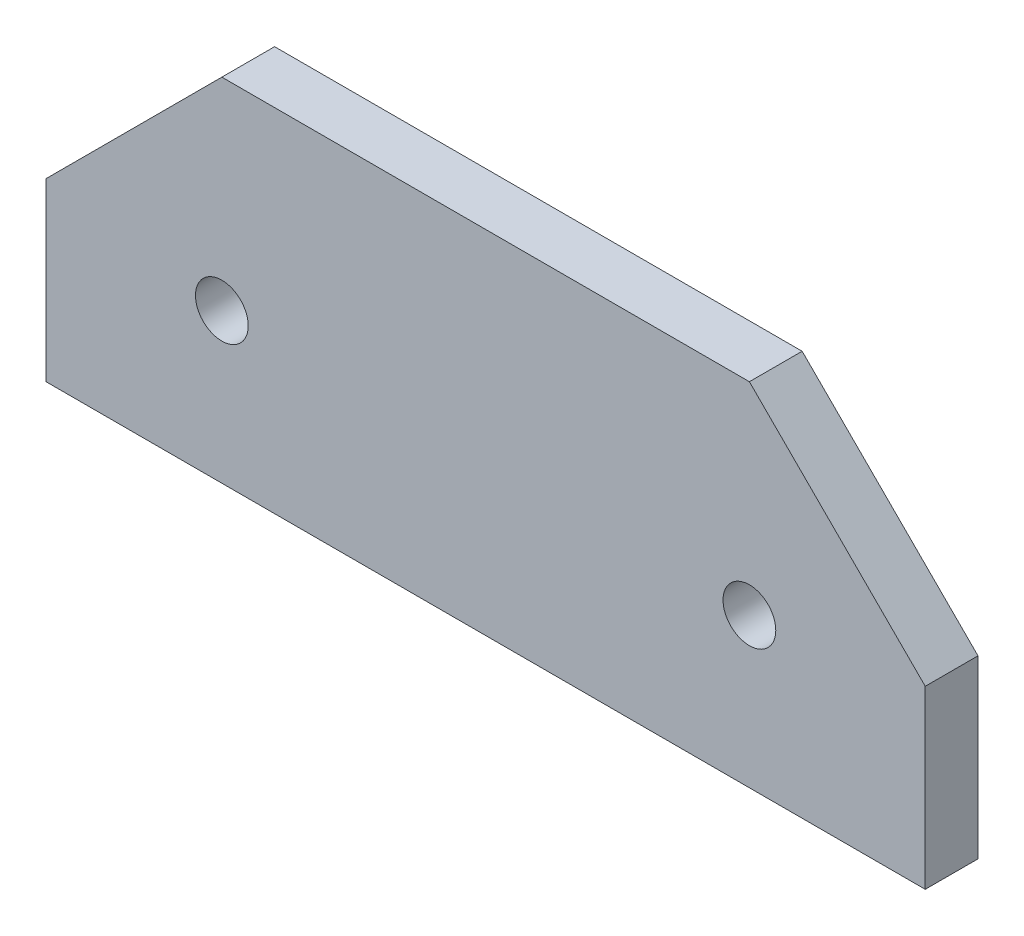
ISO-10303-21;
HEADER;
FILE_DESCRIPTION(('STEP AP214'),'2;1');
FILE_NAME('part.step','',(''),(''),'','','');
FILE_SCHEMA(('AUTOMOTIVE_DESIGN { 1 0 10303 214 1 1 1 1 }'));
ENDSEC;
DATA;
#1=APPLICATION_CONTEXT('core data for automotive mechanical design processes');
#2=APPLICATION_PROTOCOL_DEFINITION('international standard','automotive_design',2000,#1);
#3=PRODUCT_CONTEXT('',#1,'mechanical');
#4=PRODUCT('Part','Part','',(#3));
#5=PRODUCT_RELATED_PRODUCT_CATEGORY('part','',(#4));
#6=PRODUCT_DEFINITION_FORMATION('','',#4);
#7=PRODUCT_DEFINITION_CONTEXT('part definition',#1,'design');
#8=PRODUCT_DEFINITION('design','',#6,#7);
#9=PRODUCT_DEFINITION_SHAPE('','',#8);
#10=(LENGTH_UNIT() NAMED_UNIT(*) SI_UNIT(.MILLI.,.METRE.));
#11=(NAMED_UNIT(*) PLANE_ANGLE_UNIT() SI_UNIT($,.RADIAN.));
#12=(NAMED_UNIT(*) SI_UNIT($,.STERADIAN.) SOLID_ANGLE_UNIT());
#13=UNCERTAINTY_MEASURE_WITH_UNIT(LENGTH_MEASURE(1.E-05),#10,'distance_accuracy_value','');
#14=(GEOMETRIC_REPRESENTATION_CONTEXT(3) GLOBAL_UNCERTAINTY_ASSIGNED_CONTEXT((#13)) GLOBAL_UNIT_ASSIGNED_CONTEXT((#10,
#11,#12)) REPRESENTATION_CONTEXT('',''));
#15=CARTESIAN_POINT('',(0.,0.,0.));
#16=DIRECTION('',(0.,0.,1.));
#17=DIRECTION('',(1.,0.,0.));
#18=AXIS2_PLACEMENT_3D('',#15,#16,#17);
#19=CARTESIAN_POINT('',(0.,0.,3.));
#20=DIRECTION('',(0.,0.,-1.));
#21=DIRECTION('',(-1.,0.,0.));
#22=AXIS2_PLACEMENT_3D('',#19,#20,#21);
#23=PLANE('',#22);
#24=CARTESIAN_POINT('',(-15.,-1.5,3.));
#25=DIRECTION('',(0.,0.,1.));
#26=DIRECTION('',(1.,0.,0.));
#27=AXIS2_PLACEMENT_3D('',#24,#25,#26);
#28=CIRCLE('',#27,1.5);
#29=CARTESIAN_POINT('',(-13.5,-1.5,3.));
#30=VERTEX_POINT('',#29);
#31=EDGE_CURVE('E121',#30,#30,#28,.T.);
#32=ORIENTED_EDGE('',*,*,#31,.F.);
#33=EDGE_LOOP('',(#32));
#34=FACE_BOUND('',#33,.T.);
#35=DIRECTION('',(0.,-1.,0.));
#36=VECTOR('',#35,1.);
#37=CARTESIAN_POINT('',(-25.,-10.,3.));
#38=LINE('',#37,#36);
#39=CARTESIAN_POINT('',(-25.,0.,3.));
#40=VERTEX_POINT('',#39);
#41=CARTESIAN_POINT('',(-25.,-10.,3.));
#42=VERTEX_POINT('',#41);
#43=EDGE_CURVE('E128',#40,#42,#38,.T.);
#44=ORIENTED_EDGE('',*,*,#43,.T.);
#45=DIRECTION('',(1.,0.,0.));
#46=VECTOR('',#45,1.);
#47=CARTESIAN_POINT('',(-25.,-10.,3.));
#48=LINE('',#47,#46);
#49=CARTESIAN_POINT('',(25.,-10.,3.));
#50=VERTEX_POINT('',#49);
#51=EDGE_CURVE('E86',#42,#50,#48,.T.);
#52=ORIENTED_EDGE('',*,*,#51,.T.);
#53=DIRECTION('',(0.,1.,0.));
#54=VECTOR('',#53,1.);
#55=CARTESIAN_POINT('',(25.,-10.,3.));
#56=LINE('',#55,#54);
#57=CARTESIAN_POINT('',(25.,0.,3.));
#58=VERTEX_POINT('',#57);
#59=EDGE_CURVE('E99',#50,#58,#56,.T.);
#60=ORIENTED_EDGE('',*,*,#59,.T.);
#61=DIRECTION('',(-0.707106781186548,0.707106781186548,0.));
#62=VECTOR('',#61,1.);
#63=CARTESIAN_POINT('',(15.,10.,3.));
#64=LINE('',#63,#62);
#65=CARTESIAN_POINT('',(15.,10.,3.));
#66=VERTEX_POINT('',#65);
#67=EDGE_CURVE('E93',#58,#66,#64,.T.);
#68=ORIENTED_EDGE('',*,*,#67,.T.);
#69=DIRECTION('',(-1.,0.,0.));
#70=VECTOR('',#69,1.);
#71=CARTESIAN_POINT('',(-15.,10.,3.));
#72=LINE('',#71,#70);
#73=CARTESIAN_POINT('',(-15.,10.,3.));
#74=VERTEX_POINT('',#73);
#75=EDGE_CURVE('E97',#66,#74,#72,.T.);
#76=ORIENTED_EDGE('',*,*,#75,.T.);
#77=DIRECTION('',(-0.707106781186547,-0.707106781186548,0.));
#78=VECTOR('',#77,1.);
#79=CARTESIAN_POINT('',(-25.,0.,3.));
#80=LINE('',#79,#78);
#81=EDGE_CURVE('E49',#74,#40,#80,.T.);
#82=ORIENTED_EDGE('',*,*,#81,.T.);
#83=EDGE_LOOP('',(#44,#52,#60,#68,#76,#82));
#84=FACE_BOUND('',#83,.T.);
#85=CARTESIAN_POINT('',(15.,-1.5,3.));
#86=DIRECTION('',(0.,0.,1.));
#87=DIRECTION('',(1.,0.,0.));
#88=AXIS2_PLACEMENT_3D('',#85,#86,#87);
#89=CIRCLE('',#88,1.5);
#90=CARTESIAN_POINT('',(16.5,-1.5,3.));
#91=VERTEX_POINT('',#90);
#92=EDGE_CURVE('E171',#91,#91,#89,.T.);
#93=ORIENTED_EDGE('',*,*,#92,.F.);
#94=EDGE_LOOP('',(#93));
#95=FACE_BOUND('',#94,.T.);
#96=ADVANCED_FACE('F32',(#34,#84,#95),#23,.F.);
#97=CARTESIAN_POINT('',(0.,0.,0.));
#98=DIRECTION('',(0.,0.,-1.));
#99=DIRECTION('',(-1.,0.,0.));
#100=AXIS2_PLACEMENT_3D('',#97,#98,#99);
#101=PLANE('',#100);
#102=CARTESIAN_POINT('',(-15.,-1.5,0.));
#103=DIRECTION('',(0.,0.,1.));
#104=DIRECTION('',(1.,0.,0.));
#105=AXIS2_PLACEMENT_3D('',#102,#103,#104);
#106=CIRCLE('',#105,1.5);
#107=CARTESIAN_POINT('',(-13.5,-1.5,0.));
#108=VERTEX_POINT('',#107);
#109=EDGE_CURVE('E176',#108,#108,#106,.T.);
#110=ORIENTED_EDGE('',*,*,#109,.T.);
#111=EDGE_LOOP('',(#110));
#112=FACE_BOUND('',#111,.T.);
#113=DIRECTION('',(0.,-1.,0.));
#114=VECTOR('',#113,1.);
#115=CARTESIAN_POINT('',(-25.,-10.,0.));
#116=LINE('',#115,#114);
#117=CARTESIAN_POINT('',(-25.,0.,0.));
#118=VERTEX_POINT('',#117);
#119=CARTESIAN_POINT('',(-25.,-10.,0.));
#120=VERTEX_POINT('',#119);
#121=EDGE_CURVE('E117',#118,#120,#116,.T.);
#122=ORIENTED_EDGE('',*,*,#121,.F.);
#123=DIRECTION('',(-0.707106781186547,-0.707106781186548,0.));
#124=VECTOR('',#123,1.);
#125=CARTESIAN_POINT('',(-25.,0.,0.));
#126=LINE('',#125,#124);
#127=CARTESIAN_POINT('',(-15.,10.,0.));
#128=VERTEX_POINT('',#127);
#129=EDGE_CURVE('E78',#128,#118,#126,.T.);
#130=ORIENTED_EDGE('',*,*,#129,.F.);
#131=DIRECTION('',(-1.,0.,0.));
#132=VECTOR('',#131,1.);
#133=CARTESIAN_POINT('',(-15.,10.,0.));
#134=LINE('',#133,#132);
#135=CARTESIAN_POINT('',(15.,10.,0.));
#136=VERTEX_POINT('',#135);
#137=EDGE_CURVE('E72',#136,#128,#134,.T.);
#138=ORIENTED_EDGE('',*,*,#137,.F.);
#139=DIRECTION('',(-0.707106781186548,0.707106781186548,0.));
#140=VECTOR('',#139,1.);
#141=CARTESIAN_POINT('',(15.,10.,0.));
#142=LINE('',#141,#140);
#143=CARTESIAN_POINT('',(25.,0.,0.));
#144=VERTEX_POINT('',#143);
#145=EDGE_CURVE('E107',#144,#136,#142,.T.);
#146=ORIENTED_EDGE('',*,*,#145,.F.);
#147=DIRECTION('',(0.,1.,0.));
#148=VECTOR('',#147,1.);
#149=CARTESIAN_POINT('',(25.,-10.,0.));
#150=LINE('',#149,#148);
#151=CARTESIAN_POINT('',(25.,-10.,0.));
#152=VERTEX_POINT('',#151);
#153=EDGE_CURVE('E123',#152,#144,#150,.T.);
#154=ORIENTED_EDGE('',*,*,#153,.F.);
#155=DIRECTION('',(1.,0.,0.));
#156=VECTOR('',#155,1.);
#157=CARTESIAN_POINT('',(-25.,-10.,0.));
#158=LINE('',#157,#156);
#159=EDGE_CURVE('E120',#120,#152,#158,.T.);
#160=ORIENTED_EDGE('',*,*,#159,.F.);
#161=EDGE_LOOP('',(#122,#130,#138,#146,#154,#160));
#162=FACE_BOUND('',#161,.T.);
#163=CARTESIAN_POINT('',(15.,-1.5,0.));
#164=DIRECTION('',(0.,0.,1.));
#165=DIRECTION('',(1.,0.,0.));
#166=AXIS2_PLACEMENT_3D('',#163,#164,#165);
#167=CIRCLE('',#166,1.5);
#168=CARTESIAN_POINT('',(16.5,-1.5,0.));
#169=VERTEX_POINT('',#168);
#170=EDGE_CURVE('E174',#169,#169,#167,.T.);
#171=ORIENTED_EDGE('',*,*,#170,.T.);
#172=EDGE_LOOP('',(#171));
#173=FACE_BOUND('',#172,.T.);
#174=ADVANCED_FACE('F137',(#112,#162,#173),#101,.T.);
#175=CARTESIAN_POINT('',(-25.,-10.,3.));
#176=DIRECTION('',(1.,0.,0.));
#177=DIRECTION('',(0.,0.,-1.));
#178=AXIS2_PLACEMENT_3D('',#175,#176,#177);
#179=PLANE('',#178);
#180=ORIENTED_EDGE('',*,*,#121,.T.);
#181=DIRECTION('',(0.,0.,-1.));
#182=VECTOR('',#181,1.);
#183=CARTESIAN_POINT('',(-25.,-10.,3.));
#184=LINE('',#183,#182);
#185=EDGE_CURVE('E11',#42,#120,#184,.T.);
#186=ORIENTED_EDGE('',*,*,#185,.F.);
#187=ORIENTED_EDGE('',*,*,#43,.F.);
#188=DIRECTION('',(0.,0.,-1.));
#189=VECTOR('',#188,1.);
#190=CARTESIAN_POINT('',(-25.,0.,3.));
#191=LINE('',#190,#189);
#192=EDGE_CURVE('E113',#40,#118,#191,.T.);
#193=ORIENTED_EDGE('',*,*,#192,.T.);
#194=EDGE_LOOP('',(#180,#186,#187,#193));
#195=FACE_BOUND('',#194,.T.);
#196=ADVANCED_FACE('F34',(#195),#179,.F.);
#197=CARTESIAN_POINT('',(-25.,-10.,3.));
#198=DIRECTION('',(0.,1.,0.));
#199=DIRECTION('',(0.,0.,1.));
#200=AXIS2_PLACEMENT_3D('',#197,#198,#199);
#201=PLANE('',#200);
#202=ORIENTED_EDGE('',*,*,#159,.T.);
#203=DIRECTION('',(0.,0.,-1.));
#204=VECTOR('',#203,1.);
#205=CARTESIAN_POINT('',(25.,-10.,3.));
#206=LINE('',#205,#204);
#207=EDGE_CURVE('E41',#50,#152,#206,.T.);
#208=ORIENTED_EDGE('',*,*,#207,.F.);
#209=ORIENTED_EDGE('',*,*,#51,.F.);
#210=ORIENTED_EDGE('',*,*,#185,.T.);
#211=EDGE_LOOP('',(#202,#208,#209,#210));
#212=FACE_BOUND('',#211,.T.);
#213=ADVANCED_FACE('F217',(#212),#201,.F.);
#214=CARTESIAN_POINT('',(25.,-10.,3.));
#215=DIRECTION('',(-1.,0.,0.));
#216=DIRECTION('',(0.,-1.,0.));
#217=AXIS2_PLACEMENT_3D('',#214,#215,#216);
#218=PLANE('',#217);
#219=ORIENTED_EDGE('',*,*,#153,.T.);
#220=DIRECTION('',(0.,0.,-1.));
#221=VECTOR('',#220,1.);
#222=CARTESIAN_POINT('',(25.,0.,3.));
#223=LINE('',#222,#221);
#224=EDGE_CURVE('E108',#58,#144,#223,.T.);
#225=ORIENTED_EDGE('',*,*,#224,.F.);
#226=ORIENTED_EDGE('',*,*,#59,.F.);
#227=ORIENTED_EDGE('',*,*,#207,.T.);
#228=EDGE_LOOP('',(#219,#225,#226,#227));
#229=FACE_BOUND('',#228,.T.);
#230=ADVANCED_FACE('F134',(#229),#218,.F.);
#231=CARTESIAN_POINT('',(15.,10.,3.));
#232=DIRECTION('',(-0.707106781186547,-0.707106781186547,0.));
#233=DIRECTION('',(0.707106781186548,-0.707106781186548,0.));
#234=AXIS2_PLACEMENT_3D('',#231,#232,#233);
#235=PLANE('',#234);
#236=ORIENTED_EDGE('',*,*,#145,.T.);
#237=DIRECTION('',(0.,0.,-1.));
#238=VECTOR('',#237,1.);
#239=CARTESIAN_POINT('',(15.,10.,3.));
#240=LINE('',#239,#238);
#241=EDGE_CURVE('E104',#66,#136,#240,.T.);
#242=ORIENTED_EDGE('',*,*,#241,.F.);
#243=ORIENTED_EDGE('',*,*,#67,.F.);
#244=ORIENTED_EDGE('',*,*,#224,.T.);
#245=EDGE_LOOP('',(#236,#242,#243,#244));
#246=FACE_BOUND('',#245,.T.);
#247=ADVANCED_FACE('F105',(#246),#235,.F.);
#248=CARTESIAN_POINT('',(-15.,10.,3.));
#249=DIRECTION('',(0.,-1.,0.));
#250=DIRECTION('',(0.,0.,-1.));
#251=AXIS2_PLACEMENT_3D('',#248,#249,#250);
#252=PLANE('',#251);
#253=ORIENTED_EDGE('',*,*,#137,.T.);
#254=DIRECTION('',(0.,0.,-1.));
#255=VECTOR('',#254,1.);
#256=CARTESIAN_POINT('',(-15.,10.,3.));
#257=LINE('',#256,#255);
#258=EDGE_CURVE('E109',#74,#128,#257,.T.);
#259=ORIENTED_EDGE('',*,*,#258,.F.);
#260=ORIENTED_EDGE('',*,*,#75,.F.);
#261=ORIENTED_EDGE('',*,*,#241,.T.);
#262=EDGE_LOOP('',(#253,#259,#260,#261));
#263=FACE_BOUND('',#262,.T.);
#264=ADVANCED_FACE('F111',(#263),#252,.F.);
#265=CARTESIAN_POINT('',(-25.,0.,3.));
#266=DIRECTION('',(0.707106781186548,-0.707106781186547,0.));
#267=DIRECTION('',(0.707106781186547,0.707106781186548,0.));
#268=AXIS2_PLACEMENT_3D('',#265,#266,#267);
#269=PLANE('',#268);
#270=ORIENTED_EDGE('',*,*,#129,.T.);
#271=ORIENTED_EDGE('',*,*,#192,.F.);
#272=ORIENTED_EDGE('',*,*,#81,.F.);
#273=ORIENTED_EDGE('',*,*,#258,.T.);
#274=EDGE_LOOP('',(#270,#271,#272,#273));
#275=FACE_BOUND('',#274,.T.);
#276=ADVANCED_FACE('F142',(#275),#269,.F.);
#277=CARTESIAN_POINT('',(-15.,-1.5,3.));
#278=DIRECTION('',(0.,0.,-1.));
#279=DIRECTION('',(-1.,0.,0.));
#280=AXIS2_PLACEMENT_3D('',#277,#278,#279);
#281=CYLINDRICAL_SURFACE('',#280,1.5);
#282=ORIENTED_EDGE('',*,*,#31,.T.);
#283=EDGE_LOOP('',(#282));
#284=FACE_BOUND('',#283,.T.);
#285=ORIENTED_EDGE('',*,*,#109,.F.);
#286=EDGE_LOOP('',(#285));
#287=FACE_BOUND('',#286,.T.);
#288=ADVANCED_FACE('F144',(#284,#287),#281,.F.);
#289=CARTESIAN_POINT('',(15.,-1.5,3.));
#290=DIRECTION('',(0.,0.,-1.));
#291=DIRECTION('',(-1.,0.,0.));
#292=AXIS2_PLACEMENT_3D('',#289,#290,#291);
#293=CYLINDRICAL_SURFACE('',#292,1.5);
#294=ORIENTED_EDGE('',*,*,#92,.T.);
#295=EDGE_LOOP('',(#294));
#296=FACE_BOUND('',#295,.T.);
#297=ORIENTED_EDGE('',*,*,#170,.F.);
#298=EDGE_LOOP('',(#297));
#299=FACE_BOUND('',#298,.T.);
#300=ADVANCED_FACE('F150',(#296,#299),#293,.F.);
#301=CLOSED_SHELL('',(#96,#174,#196,#213,#230,#247,#264,#276,#288,#300));
#302=MANIFOLD_SOLID_BREP('B2',#301);
#303=ADVANCED_BREP_SHAPE_REPRESENTATION('',(#18,#302),#14);
#304=SHAPE_DEFINITION_REPRESENTATION(#9,#303);
ENDSEC;
END-ISO-10303-21;
